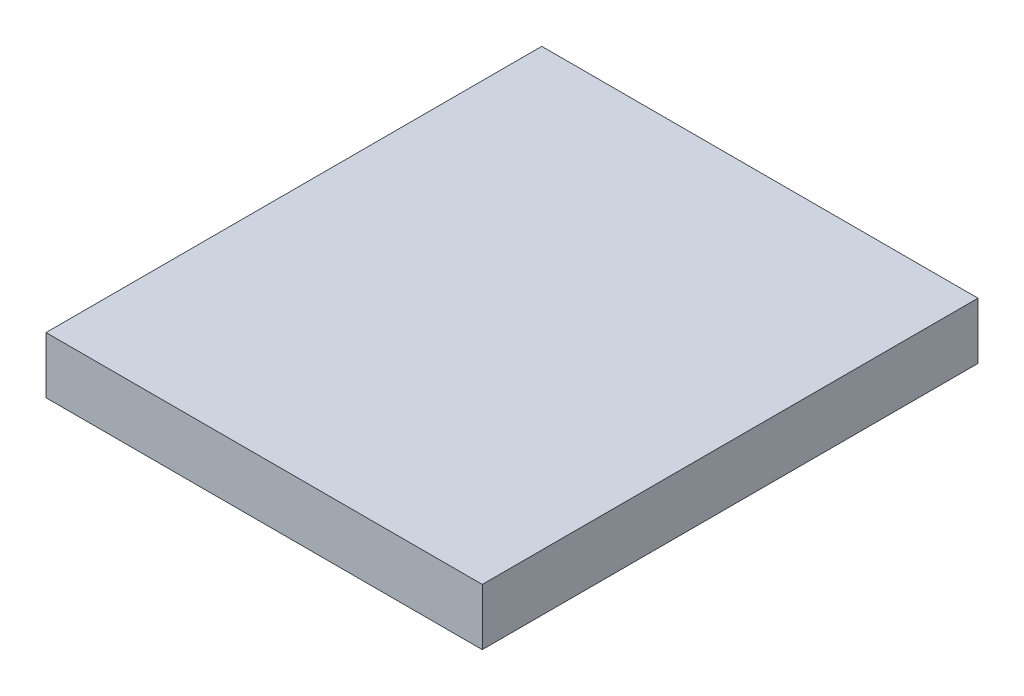
ISO-10303-21;
HEADER;
FILE_DESCRIPTION(('STEP AP214'),'2;1');
FILE_NAME('part.step','',(''),(''),'','','');
FILE_SCHEMA(('AUTOMOTIVE_DESIGN { 1 0 10303 214 1 1 1 1 }'));
ENDSEC;
DATA;
#1=APPLICATION_CONTEXT('core data for automotive mechanical design processes');
#2=APPLICATION_PROTOCOL_DEFINITION('international standard','automotive_design',2000,#1);
#3=PRODUCT_CONTEXT('',#1,'mechanical');
#4=PRODUCT('Part','Part','',(#3));
#5=PRODUCT_RELATED_PRODUCT_CATEGORY('part','',(#4));
#6=PRODUCT_DEFINITION_FORMATION('','',#4);
#7=PRODUCT_DEFINITION_CONTEXT('part definition',#1,'design');
#8=PRODUCT_DEFINITION('design','',#6,#7);
#9=PRODUCT_DEFINITION_SHAPE('','',#8);
#10=(LENGTH_UNIT() NAMED_UNIT(*) SI_UNIT(.MILLI.,.METRE.));
#11=(NAMED_UNIT(*) PLANE_ANGLE_UNIT() SI_UNIT($,.RADIAN.));
#12=(NAMED_UNIT(*) SI_UNIT($,.STERADIAN.) SOLID_ANGLE_UNIT());
#13=UNCERTAINTY_MEASURE_WITH_UNIT(LENGTH_MEASURE(1.E-05),#10,'distance_accuracy_value','');
#14=(GEOMETRIC_REPRESENTATION_CONTEXT(3) GLOBAL_UNCERTAINTY_ASSIGNED_CONTEXT((#13)) GLOBAL_UNIT_ASSIGNED_CONTEXT((#10,
#11,#12)) REPRESENTATION_CONTEXT('',''));
#15=CARTESIAN_POINT('',(0.,0.,0.));
#16=DIRECTION('',(0.,0.,1.));
#17=DIRECTION('',(1.,0.,0.));
#18=AXIS2_PLACEMENT_3D('',#15,#16,#17);
#19=CARTESIAN_POINT('',(0.,2.85,-25.));
#20=DIRECTION('',(1.,0.,0.));
#21=DIRECTION('',(0.,0.,-1.));
#22=AXIS2_PLACEMENT_3D('',#19,#20,#21);
#23=PLANE('',#22);
#24=DIRECTION('',(0.,0.,1.));
#25=VECTOR('',#24,1.);
#26=CARTESIAN_POINT('',(0.,0.,-25.));
#27=LINE('',#26,#25);
#28=CARTESIAN_POINT('',(0.,0.,-25.));
#29=VERTEX_POINT('',#28);
#30=CARTESIAN_POINT('',(0.,0.,0.));
#31=VERTEX_POINT('',#30);
#32=EDGE_CURVE('E96',#29,#31,#27,.T.);
#33=ORIENTED_EDGE('',*,*,#32,.T.);
#34=DIRECTION('',(0.,-1.,0.));
#35=VECTOR('',#34,1.);
#36=CARTESIAN_POINT('',(0.,2.85,0.));
#37=LINE('',#36,#35);
#38=CARTESIAN_POINT('',(0.,2.85,0.));
#39=VERTEX_POINT('',#38);
#40=EDGE_CURVE('E11',#39,#31,#37,.T.);
#41=ORIENTED_EDGE('',*,*,#40,.F.);
#42=DIRECTION('',(0.,0.,1.));
#43=VECTOR('',#42,1.);
#44=CARTESIAN_POINT('',(0.,2.85,-25.));
#45=LINE('',#44,#43);
#46=CARTESIAN_POINT('',(0.,2.85,-25.));
#47=VERTEX_POINT('',#46);
#48=EDGE_CURVE('E84',#47,#39,#45,.T.);
#49=ORIENTED_EDGE('',*,*,#48,.F.);
#50=DIRECTION('',(0.,-1.,0.));
#51=VECTOR('',#50,1.);
#52=CARTESIAN_POINT('',(0.,2.85,-25.));
#53=LINE('',#52,#51);
#54=EDGE_CURVE('E92',#47,#29,#53,.T.);
#55=ORIENTED_EDGE('',*,*,#54,.T.);
#56=EDGE_LOOP('',(#33,#41,#49,#55));
#57=FACE_BOUND('',#56,.T.);
#58=ADVANCED_FACE('F33',(#57),#23,.F.);
#59=CARTESIAN_POINT('',(0.,2.85,0.));
#60=DIRECTION('',(0.,0.,-1.));
#61=DIRECTION('',(-1.,0.,0.));
#62=AXIS2_PLACEMENT_3D('',#59,#60,#61);
#63=PLANE('',#62);
#64=DIRECTION('',(1.,0.,0.));
#65=VECTOR('',#64,1.);
#66=CARTESIAN_POINT('',(0.,0.,0.));
#67=LINE('',#66,#65);
#68=CARTESIAN_POINT('',(22.,0.,0.));
#69=VERTEX_POINT('',#68);
#70=EDGE_CURVE('E88',#31,#69,#67,.T.);
#71=ORIENTED_EDGE('',*,*,#70,.T.);
#72=DIRECTION('',(0.,-1.,0.));
#73=VECTOR('',#72,1.);
#74=CARTESIAN_POINT('',(22.,2.85,0.));
#75=LINE('',#74,#73);
#76=CARTESIAN_POINT('',(22.,2.85,0.));
#77=VERTEX_POINT('',#76);
#78=EDGE_CURVE('E41',#77,#69,#75,.T.);
#79=ORIENTED_EDGE('',*,*,#78,.F.);
#80=DIRECTION('',(1.,0.,0.));
#81=VECTOR('',#80,1.);
#82=CARTESIAN_POINT('',(0.,2.85,0.));
#83=LINE('',#82,#81);
#84=EDGE_CURVE('E79',#39,#77,#83,.T.);
#85=ORIENTED_EDGE('',*,*,#84,.F.);
#86=ORIENTED_EDGE('',*,*,#40,.T.);
#87=EDGE_LOOP('',(#71,#79,#85,#86));
#88=FACE_BOUND('',#87,.T.);
#89=ADVANCED_FACE('F87',(#88),#63,.F.);
#90=CARTESIAN_POINT('',(22.,2.85,-25.));
#91=DIRECTION('',(-1.,0.,0.));
#92=DIRECTION('',(0.,0.,1.));
#93=AXIS2_PLACEMENT_3D('',#90,#91,#92);
#94=PLANE('',#93);
#95=DIRECTION('',(0.,0.,-1.));
#96=VECTOR('',#95,1.);
#97=CARTESIAN_POINT('',(22.,0.,-25.));
#98=LINE('',#97,#96);
#99=CARTESIAN_POINT('',(22.,0.,-25.));
#100=VERTEX_POINT('',#99);
#101=EDGE_CURVE('E66',#69,#100,#98,.T.);
#102=ORIENTED_EDGE('',*,*,#101,.T.);
#103=DIRECTION('',(0.,-1.,0.));
#104=VECTOR('',#103,1.);
#105=CARTESIAN_POINT('',(22.,2.85,-25.));
#106=LINE('',#105,#104);
#107=CARTESIAN_POINT('',(22.,2.85,-25.));
#108=VERTEX_POINT('',#107);
#109=EDGE_CURVE('E89',#108,#100,#106,.T.);
#110=ORIENTED_EDGE('',*,*,#109,.F.);
#111=DIRECTION('',(0.,0.,-1.));
#112=VECTOR('',#111,1.);
#113=CARTESIAN_POINT('',(22.,2.85,-25.));
#114=LINE('',#113,#112);
#115=EDGE_CURVE('E82',#77,#108,#114,.T.);
#116=ORIENTED_EDGE('',*,*,#115,.F.);
#117=ORIENTED_EDGE('',*,*,#78,.T.);
#118=EDGE_LOOP('',(#102,#110,#116,#117));
#119=FACE_BOUND('',#118,.T.);
#120=ADVANCED_FACE('F90',(#119),#94,.F.);
#121=CARTESIAN_POINT('',(0.,2.85,-25.));
#122=DIRECTION('',(0.,0.,1.));
#123=DIRECTION('',(1.,0.,0.));
#124=AXIS2_PLACEMENT_3D('',#121,#122,#123);
#125=PLANE('',#124);
#126=DIRECTION('',(-1.,0.,0.));
#127=VECTOR('',#126,1.);
#128=CARTESIAN_POINT('',(0.,0.,-25.));
#129=LINE('',#128,#127);
#130=EDGE_CURVE('E72',#100,#29,#129,.T.);
#131=ORIENTED_EDGE('',*,*,#130,.T.);
#132=ORIENTED_EDGE('',*,*,#54,.F.);
#133=DIRECTION('',(-1.,0.,0.));
#134=VECTOR('',#133,1.);
#135=CARTESIAN_POINT('',(0.,2.85,-25.));
#136=LINE('',#135,#134);
#137=EDGE_CURVE('E49',#108,#47,#136,.T.);
#138=ORIENTED_EDGE('',*,*,#137,.F.);
#139=ORIENTED_EDGE('',*,*,#109,.T.);
#140=EDGE_LOOP('',(#131,#132,#138,#139));
#141=FACE_BOUND('',#140,.T.);
#142=ADVANCED_FACE('F103',(#141),#125,.F.);
#143=CARTESIAN_POINT('',(0.,2.85,0.));
#144=DIRECTION('',(0.,1.,0.));
#145=DIRECTION('',(0.,0.,1.));
#146=AXIS2_PLACEMENT_3D('',#143,#144,#145);
#147=PLANE('',#146);
#148=ORIENTED_EDGE('',*,*,#48,.T.);
#149=ORIENTED_EDGE('',*,*,#84,.T.);
#150=ORIENTED_EDGE('',*,*,#115,.T.);
#151=ORIENTED_EDGE('',*,*,#137,.T.);
#152=EDGE_LOOP('',(#148,#149,#150,#151));
#153=FACE_BOUND('',#152,.T.);
#154=ADVANCED_FACE('F80',(#153),#147,.T.);
#155=CARTESIAN_POINT('',(0.,0.,0.));
#156=DIRECTION('',(0.,1.,0.));
#157=DIRECTION('',(0.,0.,1.));
#158=AXIS2_PLACEMENT_3D('',#155,#156,#157);
#159=PLANE('',#158);
#160=ORIENTED_EDGE('',*,*,#32,.F.);
#161=ORIENTED_EDGE('',*,*,#130,.F.);
#162=ORIENTED_EDGE('',*,*,#101,.F.);
#163=ORIENTED_EDGE('',*,*,#70,.F.);
#164=EDGE_LOOP('',(#160,#161,#162,#163));
#165=FACE_BOUND('',#164,.T.);
#166=ADVANCED_FACE('F106',(#165),#159,.F.);
#167=CLOSED_SHELL('',(#58,#89,#120,#142,#154,#166));
#168=MANIFOLD_SOLID_BREP('B2',#167);
#169=ADVANCED_BREP_SHAPE_REPRESENTATION('',(#18,#168),#14);
#170=SHAPE_DEFINITION_REPRESENTATION(#9,#169);
ENDSEC;
END-ISO-10303-21;
